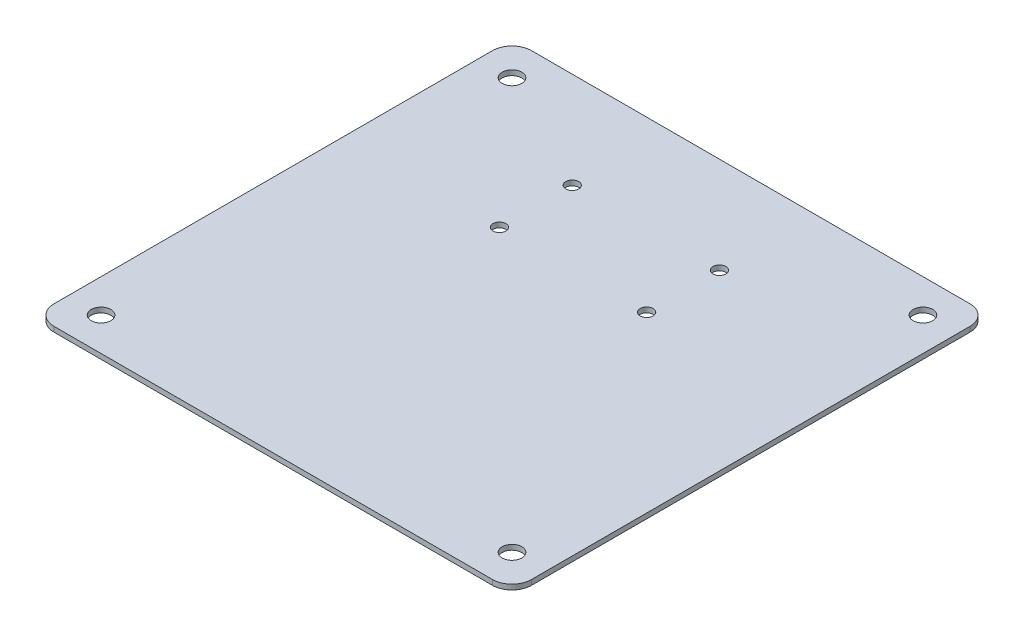
ISO-10303-21;
HEADER;
FILE_DESCRIPTION(('STEP AP214'),'2;1');
FILE_NAME('part.step','',(''),(''),'','','');
FILE_SCHEMA(('AUTOMOTIVE_DESIGN { 1 0 10303 214 1 1 1 1 }'));
ENDSEC;
DATA;
#1=APPLICATION_CONTEXT('core data for automotive mechanical design processes');
#2=APPLICATION_PROTOCOL_DEFINITION('international standard','automotive_design',2000,#1);
#3=PRODUCT_CONTEXT('',#1,'mechanical');
#4=PRODUCT('Part','Part','',(#3));
#5=PRODUCT_RELATED_PRODUCT_CATEGORY('part','',(#4));
#6=PRODUCT_DEFINITION_FORMATION('','',#4);
#7=PRODUCT_DEFINITION_CONTEXT('part definition',#1,'design');
#8=PRODUCT_DEFINITION('design','',#6,#7);
#9=PRODUCT_DEFINITION_SHAPE('','',#8);
#10=(LENGTH_UNIT() NAMED_UNIT(*) SI_UNIT(.MILLI.,.METRE.));
#11=(NAMED_UNIT(*) PLANE_ANGLE_UNIT() SI_UNIT($,.RADIAN.));
#12=(NAMED_UNIT(*) SI_UNIT($,.STERADIAN.) SOLID_ANGLE_UNIT());
#13=UNCERTAINTY_MEASURE_WITH_UNIT(LENGTH_MEASURE(1.E-05),#10,'distance_accuracy_value','');
#14=(GEOMETRIC_REPRESENTATION_CONTEXT(3) GLOBAL_UNCERTAINTY_ASSIGNED_CONTEXT((#13)) GLOBAL_UNIT_ASSIGNED_CONTEXT((#10,
#11,#12)) REPRESENTATION_CONTEXT('',''));
#15=CARTESIAN_POINT('',(0.,0.,0.));
#16=DIRECTION('',(0.,0.,1.));
#17=DIRECTION('',(1.,0.,0.));
#18=AXIS2_PLACEMENT_3D('',#15,#16,#17);
#19=CARTESIAN_POINT('',(61.,-1.3,-61.));
#20=DIRECTION('',(1.,0.,0.));
#21=DIRECTION('',(0.,0.,-1.));
#22=AXIS2_PLACEMENT_3D('',#19,#20,#21);
#23=PLANE('',#22);
#24=DIRECTION('',(0.,0.,-1.));
#25=VECTOR('',#24,1.);
#26=CARTESIAN_POINT('',(61.,-1.3,-61.));
#27=LINE('',#26,#25);
#28=CARTESIAN_POINT('',(61.,-1.3,56.));
#29=VERTEX_POINT('',#28);
#30=CARTESIAN_POINT('',(61.,-1.3,-56.));
#31=VERTEX_POINT('',#30);
#32=EDGE_CURVE('E208',#29,#31,#27,.T.);
#33=ORIENTED_EDGE('',*,*,#32,.T.);
#34=DIRECTION('',(0.,1.,0.));
#35=VECTOR('',#34,1.);
#36=CARTESIAN_POINT('',(61.,-1.3,-56.));
#37=LINE('',#36,#35);
#38=CARTESIAN_POINT('',(61.,0.,-56.));
#39=VERTEX_POINT('',#38);
#40=EDGE_CURVE('E118',#31,#39,#37,.T.);
#41=ORIENTED_EDGE('',*,*,#40,.T.);
#42=DIRECTION('',(0.,0.,-1.));
#43=VECTOR('',#42,1.);
#44=CARTESIAN_POINT('',(61.,0.,-61.));
#45=LINE('',#44,#43);
#46=CARTESIAN_POINT('',(61.,0.,56.));
#47=VERTEX_POINT('',#46);
#48=EDGE_CURVE('E110',#47,#39,#45,.T.);
#49=ORIENTED_EDGE('',*,*,#48,.F.);
#50=DIRECTION('',(0.,1.,0.));
#51=VECTOR('',#50,1.);
#52=CARTESIAN_POINT('',(61.,-1.3,56.));
#53=LINE('',#52,#51);
#54=EDGE_CURVE('E123',#47,#29,#53,.F.);
#55=ORIENTED_EDGE('',*,*,#54,.T.);
#56=EDGE_LOOP('',(#33,#41,#49,#55));
#57=FACE_BOUND('',#56,.T.);
#58=ADVANCED_FACE('F39',(#57),#23,.T.);
#59=CARTESIAN_POINT('',(-61.,-1.3,61.));
#60=DIRECTION('',(0.,0.,1.));
#61=DIRECTION('',(1.,0.,0.));
#62=AXIS2_PLACEMENT_3D('',#59,#60,#61);
#63=PLANE('',#62);
#64=DIRECTION('',(1.,0.,0.));
#65=VECTOR('',#64,1.);
#66=CARTESIAN_POINT('',(-61.,0.,61.));
#67=LINE('',#66,#65);
#68=CARTESIAN_POINT('',(-56.,0.,61.));
#69=VERTEX_POINT('',#68);
#70=CARTESIAN_POINT('',(56.,0.,61.));
#71=VERTEX_POINT('',#70);
#72=EDGE_CURVE('E112',#69,#71,#67,.T.);
#73=ORIENTED_EDGE('',*,*,#72,.F.);
#74=DIRECTION('',(0.,1.,0.));
#75=VECTOR('',#74,1.);
#76=CARTESIAN_POINT('',(-56.,-1.3,61.));
#77=LINE('',#76,#75);
#78=CARTESIAN_POINT('',(-56.,-1.3,61.));
#79=VERTEX_POINT('',#78);
#80=EDGE_CURVE('E11',#69,#79,#77,.F.);
#81=ORIENTED_EDGE('',*,*,#80,.T.);
#82=DIRECTION('',(1.,0.,0.));
#83=VECTOR('',#82,1.);
#84=CARTESIAN_POINT('',(-61.,-1.3,61.));
#85=LINE('',#84,#83);
#86=CARTESIAN_POINT('',(56.,-1.3,61.));
#87=VERTEX_POINT('',#86);
#88=EDGE_CURVE('E131',#79,#87,#85,.T.);
#89=ORIENTED_EDGE('',*,*,#88,.T.);
#90=DIRECTION('',(0.,1.,0.));
#91=VECTOR('',#90,1.);
#92=CARTESIAN_POINT('',(56.,-1.3,61.));
#93=LINE('',#92,#91);
#94=EDGE_CURVE('E48',#87,#71,#93,.T.);
#95=ORIENTED_EDGE('',*,*,#94,.T.);
#96=EDGE_LOOP('',(#73,#81,#89,#95));
#97=FACE_BOUND('',#96,.T.);
#98=ADVANCED_FACE('F233',(#97),#63,.T.);
#99=CARTESIAN_POINT('',(-61.,-1.3,-61.));
#100=DIRECTION('',(-1.,0.,0.));
#101=DIRECTION('',(0.,0.,1.));
#102=AXIS2_PLACEMENT_3D('',#99,#100,#101);
#103=PLANE('',#102);
#104=DIRECTION('',(0.,0.,1.));
#105=VECTOR('',#104,1.);
#106=CARTESIAN_POINT('',(-61.,0.,-61.));
#107=LINE('',#106,#105);
#108=CARTESIAN_POINT('',(-61.,0.,-56.));
#109=VERTEX_POINT('',#108);
#110=CARTESIAN_POINT('',(-61.,0.,56.));
#111=VERTEX_POINT('',#110);
#112=EDGE_CURVE('E215',#109,#111,#107,.T.);
#113=ORIENTED_EDGE('',*,*,#112,.F.);
#114=DIRECTION('',(0.,1.,0.));
#115=VECTOR('',#114,1.);
#116=CARTESIAN_POINT('',(-61.,-1.3,-56.));
#117=LINE('',#116,#115);
#118=CARTESIAN_POINT('',(-61.,-1.3,-56.));
#119=VERTEX_POINT('',#118);
#120=EDGE_CURVE('E63',#109,#119,#117,.F.);
#121=ORIENTED_EDGE('',*,*,#120,.T.);
#122=DIRECTION('',(0.,0.,1.));
#123=VECTOR('',#122,1.);
#124=CARTESIAN_POINT('',(-61.,-1.3,-61.));
#125=LINE('',#124,#123);
#126=CARTESIAN_POINT('',(-61.,-1.3,56.));
#127=VERTEX_POINT('',#126);
#128=EDGE_CURVE('E135',#119,#127,#125,.T.);
#129=ORIENTED_EDGE('',*,*,#128,.T.);
#130=DIRECTION('',(0.,1.,0.));
#131=VECTOR('',#130,1.);
#132=CARTESIAN_POINT('',(-61.,-1.3,56.));
#133=LINE('',#132,#131);
#134=EDGE_CURVE('E156',#127,#111,#133,.T.);
#135=ORIENTED_EDGE('',*,*,#134,.T.);
#136=EDGE_LOOP('',(#113,#121,#129,#135));
#137=FACE_BOUND('',#136,.T.);
#138=ADVANCED_FACE('F217',(#137),#103,.T.);
#139=CARTESIAN_POINT('',(-61.,-1.3,-61.));
#140=DIRECTION('',(0.,0.,-1.));
#141=DIRECTION('',(-1.,0.,0.));
#142=AXIS2_PLACEMENT_3D('',#139,#140,#141);
#143=PLANE('',#142);
#144=DIRECTION('',(-1.,0.,0.));
#145=VECTOR('',#144,1.);
#146=CARTESIAN_POINT('',(-61.,0.,-61.));
#147=LINE('',#146,#145);
#148=CARTESIAN_POINT('',(56.,0.,-61.));
#149=VERTEX_POINT('',#148);
#150=CARTESIAN_POINT('',(-56.,0.,-61.));
#151=VERTEX_POINT('',#150);
#152=EDGE_CURVE('E126',#149,#151,#147,.T.);
#153=ORIENTED_EDGE('',*,*,#152,.F.);
#154=DIRECTION('',(0.,1.,0.));
#155=VECTOR('',#154,1.);
#156=CARTESIAN_POINT('',(56.,-1.3,-61.));
#157=LINE('',#156,#155);
#158=CARTESIAN_POINT('',(56.,-1.3,-61.));
#159=VERTEX_POINT('',#158);
#160=EDGE_CURVE('E148',#149,#159,#157,.F.);
#161=ORIENTED_EDGE('',*,*,#160,.T.);
#162=DIRECTION('',(-1.,0.,0.));
#163=VECTOR('',#162,1.);
#164=CARTESIAN_POINT('',(-61.,-1.3,-61.));
#165=LINE('',#164,#163);
#166=CARTESIAN_POINT('',(-56.,-1.3,-61.));
#167=VERTEX_POINT('',#166);
#168=EDGE_CURVE('E210',#159,#167,#165,.T.);
#169=ORIENTED_EDGE('',*,*,#168,.T.);
#170=DIRECTION('',(0.,1.,0.));
#171=VECTOR('',#170,1.);
#172=CARTESIAN_POINT('',(-56.,-1.3,-61.));
#173=LINE('',#172,#171);
#174=EDGE_CURVE('E145',#167,#151,#173,.T.);
#175=ORIENTED_EDGE('',*,*,#174,.T.);
#176=EDGE_LOOP('',(#153,#161,#169,#175));
#177=FACE_BOUND('',#176,.T.);
#178=ADVANCED_FACE('F228',(#177),#143,.T.);
#179=CARTESIAN_POINT('',(0.,-1.3,0.));
#180=DIRECTION('',(0.,1.,0.));
#181=DIRECTION('',(0.,0.,1.));
#182=AXIS2_PLACEMENT_3D('',#179,#180,#181);
#183=PLANE('',#182);
#184=CARTESIAN_POINT('',(16.5761517511296,-1.3,-36.422526924364));
#185=DIRECTION('',(0.,-1.,0.));
#186=DIRECTION('',(0.,0.,-1.));
#187=AXIS2_PLACEMENT_3D('',#184,#185,#186);
#188=CIRCLE('',#187,1.64999999940053);
#189=CARTESIAN_POINT('',(16.5761517511296,-1.3,-38.0725269237645));
#190=VERTEX_POINT('',#189);
#191=EDGE_CURVE('E181',#190,#190,#188,.T.);
#192=ORIENTED_EDGE('',*,*,#191,.F.);
#193=EDGE_LOOP('',(#192));
#194=FACE_BOUND('',#193,.T.);
#195=CARTESIAN_POINT('',(16.5761517511296,-1.3,-17.822526924364));
#196=DIRECTION('',(0.,-1.,0.));
#197=DIRECTION('',(0.,0.,-1.));
#198=AXIS2_PLACEMENT_3D('',#195,#196,#197);
#199=CIRCLE('',#198,1.64999999939961);
#200=CARTESIAN_POINT('',(16.5761517511296,-1.3,-19.4725269237636));
#201=VERTEX_POINT('',#200);
#202=EDGE_CURVE('E171',#201,#201,#199,.T.);
#203=ORIENTED_EDGE('',*,*,#202,.F.);
#204=EDGE_LOOP('',(#203));
#205=FACE_BOUND('',#204,.T.);
#206=CARTESIAN_POINT('',(-21.0238482488704,-1.3,-17.822526924364));
#207=DIRECTION('',(0.,-1.,0.));
#208=DIRECTION('',(0.,0.,-1.));
#209=AXIS2_PLACEMENT_3D('',#206,#207,#208);
#210=CIRCLE('',#209,1.64999999940053);
#211=CARTESIAN_POINT('',(-21.0238482488704,-1.3,-19.4725269237645));
#212=VERTEX_POINT('',#211);
#213=EDGE_CURVE('E168',#212,#212,#210,.T.);
#214=ORIENTED_EDGE('',*,*,#213,.F.);
#215=EDGE_LOOP('',(#214));
#216=FACE_BOUND('',#215,.T.);
#217=CARTESIAN_POINT('',(-21.0238482488704,-1.3,-36.422526924364));
#218=DIRECTION('',(0.,-1.,0.));
#219=DIRECTION('',(0.,0.,-1.));
#220=AXIS2_PLACEMENT_3D('',#217,#218,#219);
#221=CIRCLE('',#220,1.64999999940053);
#222=CARTESIAN_POINT('',(-21.0238482488704,-1.3,-38.0725269237645));
#223=VERTEX_POINT('',#222);
#224=EDGE_CURVE('E165',#223,#223,#221,.T.);
#225=ORIENTED_EDGE('',*,*,#224,.F.);
#226=EDGE_LOOP('',(#225));
#227=FACE_BOUND('',#226,.T.);
#228=CARTESIAN_POINT('',(52.5,-1.3,52.5));
#229=DIRECTION('',(0.,1.,0.));
#230=DIRECTION('',(0.,0.,1.));
#231=AXIS2_PLACEMENT_3D('',#228,#229,#230);
#232=CIRCLE('',#231,2.5);
#233=CARTESIAN_POINT('',(52.5,-1.3,55.));
#234=VERTEX_POINT('',#233);
#235=EDGE_CURVE('E188',#234,#234,#232,.T.);
#236=ORIENTED_EDGE('',*,*,#235,.T.);
#237=EDGE_LOOP('',(#236));
#238=FACE_BOUND('',#237,.T.);
#239=CARTESIAN_POINT('',(-52.5,-1.3,52.5));
#240=DIRECTION('',(0.,1.,0.));
#241=DIRECTION('',(0.,0.,1.));
#242=AXIS2_PLACEMENT_3D('',#239,#240,#241);
#243=CIRCLE('',#242,2.5);
#244=CARTESIAN_POINT('',(-52.5,-1.3,55.));
#245=VERTEX_POINT('',#244);
#246=EDGE_CURVE('E194',#245,#245,#243,.T.);
#247=ORIENTED_EDGE('',*,*,#246,.T.);
#248=EDGE_LOOP('',(#247));
#249=FACE_BOUND('',#248,.T.);
#250=CARTESIAN_POINT('',(-52.5,-1.3,-52.5));
#251=DIRECTION('',(0.,1.,0.));
#252=DIRECTION('',(0.,0.,1.));
#253=AXIS2_PLACEMENT_3D('',#250,#251,#252);
#254=CIRCLE('',#253,2.5);
#255=CARTESIAN_POINT('',(-52.5,-1.3,-50.));
#256=VERTEX_POINT('',#255);
#257=EDGE_CURVE('E200',#256,#256,#254,.T.);
#258=ORIENTED_EDGE('',*,*,#257,.T.);
#259=EDGE_LOOP('',(#258));
#260=FACE_BOUND('',#259,.T.);
#261=CARTESIAN_POINT('',(52.5,-1.3,-52.5));
#262=DIRECTION('',(0.,1.,0.));
#263=DIRECTION('',(0.,0.,1.));
#264=AXIS2_PLACEMENT_3D('',#261,#262,#263);
#265=CIRCLE('',#264,2.5);
#266=CARTESIAN_POINT('',(52.5,-1.3,-50.));
#267=VERTEX_POINT('',#266);
#268=EDGE_CURVE('E127',#267,#267,#265,.T.);
#269=ORIENTED_EDGE('',*,*,#268,.T.);
#270=EDGE_LOOP('',(#269));
#271=FACE_BOUND('',#270,.T.);
#272=ORIENTED_EDGE('',*,*,#168,.F.);
#273=CARTESIAN_POINT('',(56.,-1.3,-56.));
#274=DIRECTION('',(0.,1.,0.));
#275=DIRECTION('',(0.,0.,1.));
#276=AXIS2_PLACEMENT_3D('',#273,#274,#275);
#277=CIRCLE('',#276,5.);
#278=EDGE_CURVE('E154',#159,#31,#277,.F.);
#279=ORIENTED_EDGE('',*,*,#278,.T.);
#280=ORIENTED_EDGE('',*,*,#32,.F.);
#281=CARTESIAN_POINT('',(56.,-1.3,56.));
#282=DIRECTION('',(0.,1.,0.));
#283=DIRECTION('',(0.,0.,1.));
#284=AXIS2_PLACEMENT_3D('',#281,#282,#283);
#285=CIRCLE('',#284,5.);
#286=EDGE_CURVE('E130',#29,#87,#285,.F.);
#287=ORIENTED_EDGE('',*,*,#286,.T.);
#288=ORIENTED_EDGE('',*,*,#88,.F.);
#289=CARTESIAN_POINT('',(-56.,-1.3,56.));
#290=DIRECTION('',(0.,1.,0.));
#291=DIRECTION('',(0.,0.,1.));
#292=AXIS2_PLACEMENT_3D('',#289,#290,#291);
#293=CIRCLE('',#292,5.);
#294=EDGE_CURVE('E56',#79,#127,#293,.F.);
#295=ORIENTED_EDGE('',*,*,#294,.T.);
#296=ORIENTED_EDGE('',*,*,#128,.F.);
#297=CARTESIAN_POINT('',(-56.,-1.3,-56.));
#298=DIRECTION('',(0.,1.,0.));
#299=DIRECTION('',(0.,0.,1.));
#300=AXIS2_PLACEMENT_3D('',#297,#298,#299);
#301=CIRCLE('',#300,5.);
#302=EDGE_CURVE('E152',#119,#167,#301,.F.);
#303=ORIENTED_EDGE('',*,*,#302,.T.);
#304=EDGE_LOOP('',(#272,#279,#280,#287,#288,#295,#296,#303));
#305=FACE_BOUND('',#304,.T.);
#306=ADVANCED_FACE('F224',(#194,#205,#216,#227,#238,#249,#260,#271,#305),#183,.F.);
#307=CARTESIAN_POINT('',(0.,0.,0.));
#308=DIRECTION('',(0.,1.,0.));
#309=DIRECTION('',(0.,0.,1.));
#310=AXIS2_PLACEMENT_3D('',#307,#308,#309);
#311=PLANE('',#310);
#312=CARTESIAN_POINT('',(16.5761517511296,0.,-36.422526924364));
#313=DIRECTION('',(0.,1.,0.));
#314=DIRECTION('',(0.,0.,1.));
#315=AXIS2_PLACEMENT_3D('',#312,#313,#314);
#316=CIRCLE('',#315,1.64999999940053);
#317=CARTESIAN_POINT('',(16.5761517511296,0.,-34.7725269249635));
#318=VERTEX_POINT('',#317);
#319=EDGE_CURVE('E43',#318,#318,#316,.T.);
#320=ORIENTED_EDGE('',*,*,#319,.F.);
#321=EDGE_LOOP('',(#320));
#322=FACE_BOUND('',#321,.T.);
#323=CARTESIAN_POINT('',(16.5761517511296,0.,-17.822526924364));
#324=DIRECTION('',(0.,1.,0.));
#325=DIRECTION('',(0.,0.,1.));
#326=AXIS2_PLACEMENT_3D('',#323,#324,#325);
#327=CIRCLE('',#326,1.64999999939961);
#328=CARTESIAN_POINT('',(16.5761517511296,0.,-16.1725269249644));
#329=VERTEX_POINT('',#328);
#330=EDGE_CURVE('E169',#329,#329,#327,.T.);
#331=ORIENTED_EDGE('',*,*,#330,.F.);
#332=EDGE_LOOP('',(#331));
#333=FACE_BOUND('',#332,.T.);
#334=CARTESIAN_POINT('',(-21.0238482488704,0.,-17.822526924364));
#335=DIRECTION('',(0.,1.,0.));
#336=DIRECTION('',(0.,0.,1.));
#337=AXIS2_PLACEMENT_3D('',#334,#335,#336);
#338=CIRCLE('',#337,1.64999999940053);
#339=CARTESIAN_POINT('',(-21.0238482488704,0.,-16.1725269249635));
#340=VERTEX_POINT('',#339);
#341=EDGE_CURVE('E166',#340,#340,#338,.T.);
#342=ORIENTED_EDGE('',*,*,#341,.F.);
#343=EDGE_LOOP('',(#342));
#344=FACE_BOUND('',#343,.T.);
#345=CARTESIAN_POINT('',(-21.0238482488704,0.,-36.422526924364));
#346=DIRECTION('',(0.,1.,0.));
#347=DIRECTION('',(0.,0.,1.));
#348=AXIS2_PLACEMENT_3D('',#345,#346,#347);
#349=CIRCLE('',#348,1.64999999940053);
#350=CARTESIAN_POINT('',(-21.0238482488704,0.,-34.7725269249635));
#351=VERTEX_POINT('',#350);
#352=EDGE_CURVE('E161',#351,#351,#349,.T.);
#353=ORIENTED_EDGE('',*,*,#352,.F.);
#354=EDGE_LOOP('',(#353));
#355=FACE_BOUND('',#354,.T.);
#356=CARTESIAN_POINT('',(52.5,0.,52.5));
#357=DIRECTION('',(0.,1.,0.));
#358=DIRECTION('',(0.,0.,1.));
#359=AXIS2_PLACEMENT_3D('',#356,#357,#358);
#360=CIRCLE('',#359,2.5);
#361=CARTESIAN_POINT('',(52.5,0.,55.));
#362=VERTEX_POINT('',#361);
#363=EDGE_CURVE('E164',#362,#362,#360,.T.);
#364=ORIENTED_EDGE('',*,*,#363,.F.);
#365=EDGE_LOOP('',(#364));
#366=FACE_BOUND('',#365,.T.);
#367=CARTESIAN_POINT('',(-52.5,0.,52.5));
#368=DIRECTION('',(0.,1.,0.));
#369=DIRECTION('',(0.,0.,1.));
#370=AXIS2_PLACEMENT_3D('',#367,#368,#369);
#371=CIRCLE('',#370,2.5);
#372=CARTESIAN_POINT('',(-52.5,0.,55.));
#373=VERTEX_POINT('',#372);
#374=EDGE_CURVE('E191',#373,#373,#371,.T.);
#375=ORIENTED_EDGE('',*,*,#374,.F.);
#376=EDGE_LOOP('',(#375));
#377=FACE_BOUND('',#376,.T.);
#378=CARTESIAN_POINT('',(-52.5,0.,-52.5));
#379=DIRECTION('',(0.,1.,0.));
#380=DIRECTION('',(0.,0.,1.));
#381=AXIS2_PLACEMENT_3D('',#378,#379,#380);
#382=CIRCLE('',#381,2.5);
#383=CARTESIAN_POINT('',(-52.5,0.,-50.));
#384=VERTEX_POINT('',#383);
#385=EDGE_CURVE('E197',#384,#384,#382,.T.);
#386=ORIENTED_EDGE('',*,*,#385,.F.);
#387=EDGE_LOOP('',(#386));
#388=FACE_BOUND('',#387,.T.);
#389=CARTESIAN_POINT('',(52.5,0.,-52.5));
#390=DIRECTION('',(0.,1.,0.));
#391=DIRECTION('',(0.,0.,1.));
#392=AXIS2_PLACEMENT_3D('',#389,#390,#391);
#393=CIRCLE('',#392,2.5);
#394=CARTESIAN_POINT('',(52.5,0.,-50.));
#395=VERTEX_POINT('',#394);
#396=EDGE_CURVE('E203',#395,#395,#393,.T.);
#397=ORIENTED_EDGE('',*,*,#396,.F.);
#398=EDGE_LOOP('',(#397));
#399=FACE_BOUND('',#398,.T.);
#400=ORIENTED_EDGE('',*,*,#48,.T.);
#401=CARTESIAN_POINT('',(56.,0.,-56.));
#402=DIRECTION('',(0.,1.,0.));
#403=DIRECTION('',(0.,0.,1.));
#404=AXIS2_PLACEMENT_3D('',#401,#402,#403);
#405=CIRCLE('',#404,5.);
#406=EDGE_CURVE('E143',#39,#149,#405,.T.);
#407=ORIENTED_EDGE('',*,*,#406,.T.);
#408=ORIENTED_EDGE('',*,*,#152,.T.);
#409=CARTESIAN_POINT('',(-56.,0.,-56.));
#410=DIRECTION('',(0.,1.,0.));
#411=DIRECTION('',(0.,0.,1.));
#412=AXIS2_PLACEMENT_3D('',#409,#410,#411);
#413=CIRCLE('',#412,5.);
#414=EDGE_CURVE('E141',#151,#109,#413,.T.);
#415=ORIENTED_EDGE('',*,*,#414,.T.);
#416=ORIENTED_EDGE('',*,*,#112,.T.);
#417=CARTESIAN_POINT('',(-56.,0.,56.));
#418=DIRECTION('',(0.,1.,0.));
#419=DIRECTION('',(0.,0.,1.));
#420=AXIS2_PLACEMENT_3D('',#417,#418,#419);
#421=CIRCLE('',#420,5.);
#422=EDGE_CURVE('E117',#111,#69,#421,.T.);
#423=ORIENTED_EDGE('',*,*,#422,.T.);
#424=ORIENTED_EDGE('',*,*,#72,.T.);
#425=CARTESIAN_POINT('',(56.,0.,56.));
#426=DIRECTION('',(0.,1.,0.));
#427=DIRECTION('',(0.,0.,1.));
#428=AXIS2_PLACEMENT_3D('',#425,#426,#427);
#429=CIRCLE('',#428,5.);
#430=EDGE_CURVE('E107',#71,#47,#429,.T.);
#431=ORIENTED_EDGE('',*,*,#430,.T.);
#432=EDGE_LOOP('',(#400,#407,#408,#415,#416,#423,#424,#431));
#433=FACE_BOUND('',#432,.T.);
#434=ADVANCED_FACE('F109',(#322,#333,#344,#355,#366,#377,#388,#399,#433),#311,.T.);
#435=CARTESIAN_POINT('',(56.,-1.3,-56.));
#436=DIRECTION('',(0.,1.,0.));
#437=DIRECTION('',(0.,0.,1.));
#438=AXIS2_PLACEMENT_3D('',#435,#436,#437);
#439=CYLINDRICAL_SURFACE('',#438,5.);
#440=ORIENTED_EDGE('',*,*,#278,.F.);
#441=ORIENTED_EDGE('',*,*,#160,.F.);
#442=ORIENTED_EDGE('',*,*,#406,.F.);
#443=ORIENTED_EDGE('',*,*,#40,.F.);
#444=EDGE_LOOP('',(#440,#441,#442,#443));
#445=FACE_BOUND('',#444,.T.);
#446=ADVANCED_FACE('F231',(#445),#439,.T.);
#447=CARTESIAN_POINT('',(-56.,-1.3,-56.));
#448=DIRECTION('',(0.,1.,0.));
#449=DIRECTION('',(0.,0.,1.));
#450=AXIS2_PLACEMENT_3D('',#447,#448,#449);
#451=CYLINDRICAL_SURFACE('',#450,5.);
#452=ORIENTED_EDGE('',*,*,#302,.F.);
#453=ORIENTED_EDGE('',*,*,#120,.F.);
#454=ORIENTED_EDGE('',*,*,#414,.F.);
#455=ORIENTED_EDGE('',*,*,#174,.F.);
#456=EDGE_LOOP('',(#452,#453,#454,#455));
#457=FACE_BOUND('',#456,.T.);
#458=ADVANCED_FACE('F221',(#457),#451,.T.);
#459=CARTESIAN_POINT('',(-56.,-1.3,56.));
#460=DIRECTION('',(0.,1.,0.));
#461=DIRECTION('',(0.,0.,1.));
#462=AXIS2_PLACEMENT_3D('',#459,#460,#461);
#463=CYLINDRICAL_SURFACE('',#462,5.);
#464=ORIENTED_EDGE('',*,*,#294,.F.);
#465=ORIENTED_EDGE('',*,*,#80,.F.);
#466=ORIENTED_EDGE('',*,*,#422,.F.);
#467=ORIENTED_EDGE('',*,*,#134,.F.);
#468=EDGE_LOOP('',(#464,#465,#466,#467));
#469=FACE_BOUND('',#468,.T.);
#470=ADVANCED_FACE('F236',(#469),#463,.T.);
#471=CARTESIAN_POINT('',(56.,-1.3,56.));
#472=DIRECTION('',(0.,1.,0.));
#473=DIRECTION('',(0.,0.,1.));
#474=AXIS2_PLACEMENT_3D('',#471,#472,#473);
#475=CYLINDRICAL_SURFACE('',#474,5.);
#476=ORIENTED_EDGE('',*,*,#286,.F.);
#477=ORIENTED_EDGE('',*,*,#54,.F.);
#478=ORIENTED_EDGE('',*,*,#430,.F.);
#479=ORIENTED_EDGE('',*,*,#94,.F.);
#480=EDGE_LOOP('',(#476,#477,#478,#479));
#481=FACE_BOUND('',#480,.T.);
#482=ADVANCED_FACE('F41',(#481),#475,.T.);
#483=CARTESIAN_POINT('',(52.5,-10.,-52.5));
#484=DIRECTION('',(0.,1.,0.));
#485=DIRECTION('',(0.,0.,1.));
#486=AXIS2_PLACEMENT_3D('',#483,#484,#485);
#487=CYLINDRICAL_SURFACE('',#486,2.5);
#488=ORIENTED_EDGE('',*,*,#396,.T.);
#489=EDGE_LOOP('',(#488));
#490=FACE_BOUND('',#489,.T.);
#491=ORIENTED_EDGE('',*,*,#268,.F.);
#492=EDGE_LOOP('',(#491));
#493=FACE_BOUND('',#492,.T.);
#494=ADVANCED_FACE('F242',(#490,#493),#487,.F.);
#495=CARTESIAN_POINT('',(-52.5,-10.,-52.5));
#496=DIRECTION('',(0.,1.,0.));
#497=DIRECTION('',(0.,0.,1.));
#498=AXIS2_PLACEMENT_3D('',#495,#496,#497);
#499=CYLINDRICAL_SURFACE('',#498,2.5);
#500=ORIENTED_EDGE('',*,*,#385,.T.);
#501=EDGE_LOOP('',(#500));
#502=FACE_BOUND('',#501,.T.);
#503=ORIENTED_EDGE('',*,*,#257,.F.);
#504=EDGE_LOOP('',(#503));
#505=FACE_BOUND('',#504,.T.);
#506=ADVANCED_FACE('F353',(#502,#505),#499,.F.);
#507=CARTESIAN_POINT('',(-52.5,-10.,52.5));
#508=DIRECTION('',(0.,1.,0.));
#509=DIRECTION('',(0.,0.,1.));
#510=AXIS2_PLACEMENT_3D('',#507,#508,#509);
#511=CYLINDRICAL_SURFACE('',#510,2.5);
#512=ORIENTED_EDGE('',*,*,#374,.T.);
#513=EDGE_LOOP('',(#512));
#514=FACE_BOUND('',#513,.T.);
#515=ORIENTED_EDGE('',*,*,#246,.F.);
#516=EDGE_LOOP('',(#515));
#517=FACE_BOUND('',#516,.T.);
#518=ADVANCED_FACE('F344',(#514,#517),#511,.F.);
#519=CARTESIAN_POINT('',(52.5,-10.,52.5));
#520=DIRECTION('',(0.,1.,0.));
#521=DIRECTION('',(0.,0.,1.));
#522=AXIS2_PLACEMENT_3D('',#519,#520,#521);
#523=CYLINDRICAL_SURFACE('',#522,2.5);
#524=ORIENTED_EDGE('',*,*,#363,.T.);
#525=EDGE_LOOP('',(#524));
#526=FACE_BOUND('',#525,.T.);
#527=ORIENTED_EDGE('',*,*,#235,.F.);
#528=EDGE_LOOP('',(#527));
#529=FACE_BOUND('',#528,.T.);
#530=ADVANCED_FACE('F284',(#526,#529),#523,.F.);
#531=CARTESIAN_POINT('',(-21.0238482488704,8.7,-36.422526924364));
#532=DIRECTION('',(0.,-1.,0.));
#533=DIRECTION('',(0.,0.,-1.));
#534=AXIS2_PLACEMENT_3D('',#531,#532,#533);
#535=CYLINDRICAL_SURFACE('',#534,1.64999999940053);
#536=ORIENTED_EDGE('',*,*,#352,.T.);
#537=EDGE_LOOP('',(#536));
#538=FACE_BOUND('',#537,.T.);
#539=ORIENTED_EDGE('',*,*,#224,.T.);
#540=EDGE_LOOP('',(#539));
#541=FACE_BOUND('',#540,.T.);
#542=ADVANCED_FACE('F295',(#538,#541),#535,.F.);
#543=CARTESIAN_POINT('',(-21.0238482488704,8.7,-17.822526924364));
#544=DIRECTION('',(0.,-1.,0.));
#545=DIRECTION('',(0.,0.,-1.));
#546=AXIS2_PLACEMENT_3D('',#543,#544,#545);
#547=CYLINDRICAL_SURFACE('',#546,1.64999999940053);
#548=ORIENTED_EDGE('',*,*,#341,.T.);
#549=EDGE_LOOP('',(#548));
#550=FACE_BOUND('',#549,.T.);
#551=ORIENTED_EDGE('',*,*,#213,.T.);
#552=EDGE_LOOP('',(#551));
#553=FACE_BOUND('',#552,.T.);
#554=ADVANCED_FACE('F300',(#550,#553),#547,.F.);
#555=CARTESIAN_POINT('',(16.5761517511296,8.7,-17.822526924364));
#556=DIRECTION('',(0.,-1.,0.));
#557=DIRECTION('',(0.,0.,-1.));
#558=AXIS2_PLACEMENT_3D('',#555,#556,#557);
#559=CYLINDRICAL_SURFACE('',#558,1.64999999939961);
#560=ORIENTED_EDGE('',*,*,#330,.T.);
#561=EDGE_LOOP('',(#560));
#562=FACE_BOUND('',#561,.T.);
#563=ORIENTED_EDGE('',*,*,#202,.T.);
#564=EDGE_LOOP('',(#563));
#565=FACE_BOUND('',#564,.T.);
#566=ADVANCED_FACE('F311',(#562,#565),#559,.F.);
#567=CARTESIAN_POINT('',(16.5761517511296,8.7,-36.422526924364));
#568=DIRECTION('',(0.,-1.,0.));
#569=DIRECTION('',(0.,0.,-1.));
#570=AXIS2_PLACEMENT_3D('',#567,#568,#569);
#571=CYLINDRICAL_SURFACE('',#570,1.64999999940053);
#572=ORIENTED_EDGE('',*,*,#319,.T.);
#573=EDGE_LOOP('',(#572));
#574=FACE_BOUND('',#573,.T.);
#575=ORIENTED_EDGE('',*,*,#191,.T.);
#576=EDGE_LOOP('',(#575));
#577=FACE_BOUND('',#576,.T.);
#578=ADVANCED_FACE('F322',(#574,#577),#571,.F.);
#579=CLOSED_SHELL('',(#58,#98,#138,#178,#306,#434,#446,#458,#470,#482,#494,#506,#518,#530,#542,
#554,#566,#578));
#580=MANIFOLD_SOLID_BREP('B2',#579);
#581=ADVANCED_BREP_SHAPE_REPRESENTATION('',(#18,#580),#14);
#582=SHAPE_DEFINITION_REPRESENTATION(#9,#581);
ENDSEC;
END-ISO-10303-21;
